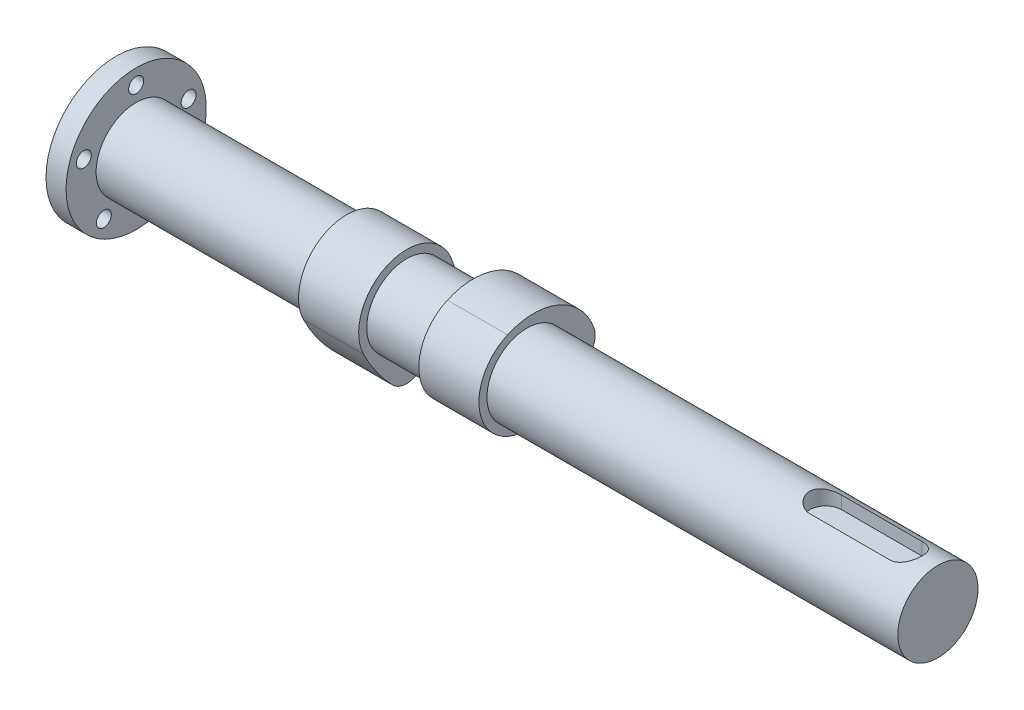
ISO-10303-21;
HEADER;
FILE_DESCRIPTION(('STEP AP214'),'2;1');
FILE_NAME('part.step','',(''),(''),'','','');
FILE_SCHEMA(('AUTOMOTIVE_DESIGN { 1 0 10303 214 1 1 1 1 }'));
ENDSEC;
DATA;
#1=APPLICATION_CONTEXT('core data for automotive mechanical design processes');
#2=APPLICATION_PROTOCOL_DEFINITION('international standard','automotive_design',2000,#1);
#3=PRODUCT_CONTEXT('',#1,'mechanical');
#4=PRODUCT('Part','Part','',(#3));
#5=PRODUCT_RELATED_PRODUCT_CATEGORY('part','',(#4));
#6=PRODUCT_DEFINITION_FORMATION('','',#4);
#7=PRODUCT_DEFINITION_CONTEXT('part definition',#1,'design');
#8=PRODUCT_DEFINITION('design','',#6,#7);
#9=PRODUCT_DEFINITION_SHAPE('','',#8);
#10=(LENGTH_UNIT() NAMED_UNIT(*) SI_UNIT(.MILLI.,.METRE.));
#11=(NAMED_UNIT(*) PLANE_ANGLE_UNIT() SI_UNIT($,.RADIAN.));
#12=(NAMED_UNIT(*) SI_UNIT($,.STERADIAN.) SOLID_ANGLE_UNIT());
#13=UNCERTAINTY_MEASURE_WITH_UNIT(LENGTH_MEASURE(1.E-05),#10,'distance_accuracy_value','');
#14=(GEOMETRIC_REPRESENTATION_CONTEXT(3) GLOBAL_UNCERTAINTY_ASSIGNED_CONTEXT((#13)) GLOBAL_UNIT_ASSIGNED_CONTEXT((#10,
#11,#12)) REPRESENTATION_CONTEXT('',''));
#15=CARTESIAN_POINT('',(0.,0.,0.));
#16=DIRECTION('',(0.,0.,1.));
#17=DIRECTION('',(1.,0.,0.));
#18=AXIS2_PLACEMENT_3D('',#15,#16,#17);
#19=CARTESIAN_POINT('',(-90.,-6.48945275792091,14.6248761670898));
#20=DIRECTION('',(1.,0.,0.));
#21=DIRECTION('',(0.,1.,0.));
#22=AXIS2_PLACEMENT_3D('',#19,#20,#21);
#23=CYLINDRICAL_SURFACE('',#22,64.);
#24=CARTESIAN_POINT('',(-30.,-6.48945275792091,14.6248761670898));
#25=DIRECTION('',(1.,0.,0.));
#26=DIRECTION('',(0.,1.,0.));
#27=AXIS2_PLACEMENT_3D('',#24,#25,#26);
#28=CIRCLE('',#27,64.);
#29=CARTESIAN_POINT('',(-30.,-66.8506881467066,-6.64767098504059));
#30=VERTEX_POINT('',#29);
#31=CARTESIAN_POINT('',(-30.,19.4683582737627,-43.8746285012695));
#32=VERTEX_POINT('',#31);
#33=EDGE_CURVE('E112',#30,#32,#28,.T.);
#34=ORIENTED_EDGE('',*,*,#33,.F.);
#35=DIRECTION('',(1.,0.,0.));
#36=VECTOR('',#35,1.);
#37=CARTESIAN_POINT('',(-90.,-66.8506881467066,-6.64767098504059));
#38=LINE('',#37,#36);
#39=CARTESIAN_POINT('',(-90.,-66.8506881467066,-6.64767098504059));
#40=VERTEX_POINT('',#39);
#41=EDGE_CURVE('E111',#40,#30,#38,.T.);
#42=ORIENTED_EDGE('',*,*,#41,.F.);
#43=CARTESIAN_POINT('',(-90.,-6.48945275792091,14.6248761670898));
#44=DIRECTION('',(1.,0.,0.));
#45=DIRECTION('',(0.,1.,0.));
#46=AXIS2_PLACEMENT_3D('',#43,#44,#45);
#47=CIRCLE('',#46,64.);
#48=CARTESIAN_POINT('',(-90.,19.4683582737627,-43.8746285012695));
#49=VERTEX_POINT('',#48);
#50=EDGE_CURVE('E106',#40,#49,#47,.T.);
#51=ORIENTED_EDGE('',*,*,#50,.T.);
#52=DIRECTION('',(1.,0.,0.));
#53=VECTOR('',#52,1.);
#54=CARTESIAN_POINT('',(-90.,19.4683582737627,-43.8746285012695));
#55=LINE('',#54,#53);
#56=EDGE_CURVE('E12',#49,#32,#55,.T.);
#57=ORIENTED_EDGE('',*,*,#56,.T.);
#58=EDGE_LOOP('',(#34,#42,#51,#57));
#59=FACE_BOUND('',#58,.T.);
#60=ADVANCED_FACE('F49',(#59),#23,.T.);
#61=CARTESIAN_POINT('',(-90.,0.,0.));
#62=DIRECTION('',(1.,0.,0.));
#63=DIRECTION('',(0.,1.,0.));
#64=AXIS2_PLACEMENT_3D('',#61,#62,#63);
#65=CYLINDRICAL_SURFACE('',#64,48.);
#66=CARTESIAN_POINT('',(-30.,0.,0.));
#67=DIRECTION('',(1.,0.,0.));
#68=DIRECTION('',(0.,-1.,0.));
#69=AXIS2_PLACEMENT_3D('',#66,#67,#68);
#70=CIRCLE('',#69,48.);
#71=CARTESIAN_POINT('',(-30.,-21.2249064673154,43.0523326366146));
#72=VERTEX_POINT('',#71);
#73=EDGE_CURVE('E114',#32,#72,#70,.T.);
#74=ORIENTED_EDGE('',*,*,#73,.F.);
#75=ORIENTED_EDGE('',*,*,#56,.F.);
#76=CARTESIAN_POINT('',(-90.,0.,0.));
#77=DIRECTION('',(1.,0.,0.));
#78=DIRECTION('',(0.,-1.,0.));
#79=AXIS2_PLACEMENT_3D('',#76,#77,#78);
#80=CIRCLE('',#79,48.);
#81=CARTESIAN_POINT('',(-90.,-21.2249064673154,43.0523326366146));
#82=VERTEX_POINT('',#81);
#83=EDGE_CURVE('E90',#49,#82,#80,.T.);
#84=ORIENTED_EDGE('',*,*,#83,.T.);
#85=DIRECTION('',(1.,0.,0.));
#86=VECTOR('',#85,1.);
#87=CARTESIAN_POINT('',(-90.,-21.2249064673154,43.0523326366146));
#88=LINE('',#87,#86);
#89=EDGE_CURVE('E57',#82,#72,#88,.T.);
#90=ORIENTED_EDGE('',*,*,#89,.T.);
#91=EDGE_LOOP('',(#74,#75,#84,#90));
#92=FACE_BOUND('',#91,.T.);
#93=ADVANCED_FACE('F104',(#92),#65,.T.);
#94=CARTESIAN_POINT('',(-90.,49.5247817570693,-100.455442818767));
#95=DIRECTION('',(1.,0.,0.));
#96=DIRECTION('',(0.,1.,0.));
#97=AXIS2_PLACEMENT_3D('',#94,#95,#96);
#98=CYLINDRICAL_SURFACE('',#97,160.);
#99=CARTESIAN_POINT('',(-30.,49.5247817570693,-100.455442818767));
#100=DIRECTION('',(1.,0.,0.));
#101=DIRECTION('',(0.,1.,0.));
#102=AXIS2_PLACEMENT_3D('',#99,#100,#101);
#103=CIRCLE('',#102,160.);
#104=CARTESIAN_POINT('',(-30.,-61.918171208394,14.3507775455384));
#105=VERTEX_POINT('',#104);
#106=EDGE_CURVE('E100',#72,#105,#103,.T.);
#107=ORIENTED_EDGE('',*,*,#106,.F.);
#108=ORIENTED_EDGE('',*,*,#89,.F.);
#109=CARTESIAN_POINT('',(-90.,49.5247817570693,-100.455442818767));
#110=DIRECTION('',(1.,0.,0.));
#111=DIRECTION('',(0.,1.,0.));
#112=AXIS2_PLACEMENT_3D('',#109,#110,#111);
#113=CIRCLE('',#112,160.);
#114=CARTESIAN_POINT('',(-90.,-61.918171208394,14.3507775455384));
#115=VERTEX_POINT('',#114);
#116=EDGE_CURVE('E93',#82,#115,#113,.T.);
#117=ORIENTED_EDGE('',*,*,#116,.T.);
#118=DIRECTION('',(1.,0.,0.));
#119=VECTOR('',#118,1.);
#120=CARTESIAN_POINT('',(-90.,-61.918171208394,14.3507775455384));
#121=LINE('',#120,#119);
#122=EDGE_CURVE('E103',#115,#105,#121,.T.);
#123=ORIENTED_EDGE('',*,*,#122,.T.);
#124=EDGE_LOOP('',(#107,#108,#117,#123));
#125=FACE_BOUND('',#124,.T.);
#126=ADVANCED_FACE('F99',(#125),#98,.T.);
#127=CARTESIAN_POINT('',(-90.,-47.987802087711,1.67548515481341E-13));
#128=DIRECTION('',(1.,0.,0.));
#129=DIRECTION('',(0.,1.,0.));
#130=AXIS2_PLACEMENT_3D('',#127,#128,#129);
#131=CYLINDRICAL_SURFACE('',#130,20.);
#132=CARTESIAN_POINT('',(-30.,-47.987802087711,1.67548515481341E-13));
#133=DIRECTION('',(1.,0.,0.));
#134=DIRECTION('',(0.,-1.,0.));
#135=AXIS2_PLACEMENT_3D('',#132,#133,#134);
#136=CIRCLE('',#135,20.);
#137=EDGE_CURVE('E79',#105,#30,#136,.T.);
#138=ORIENTED_EDGE('',*,*,#137,.F.);
#139=ORIENTED_EDGE('',*,*,#122,.F.);
#140=CARTESIAN_POINT('',(-90.,-47.987802087711,1.67548515481341E-13));
#141=DIRECTION('',(1.,0.,0.));
#142=DIRECTION('',(0.,-1.,0.));
#143=AXIS2_PLACEMENT_3D('',#140,#141,#142);
#144=CIRCLE('',#143,20.);
#145=EDGE_CURVE('E65',#115,#40,#144,.T.);
#146=ORIENTED_EDGE('',*,*,#145,.T.);
#147=ORIENTED_EDGE('',*,*,#41,.T.);
#148=EDGE_LOOP('',(#138,#139,#146,#147));
#149=FACE_BOUND('',#148,.T.);
#150=ADVANCED_FACE('F123',(#149),#131,.T.);
#151=CARTESIAN_POINT('',(-90.,-27.238627422816,7.31243808354501));
#152=DIRECTION('',(1.,0.,0.));
#153=DIRECTION('',(0.,1.,0.));
#154=AXIS2_PLACEMENT_3D('',#151,#152,#153);
#155=PLANE('',#154);
#156=ORIENTED_EDGE('',*,*,#50,.F.);
#157=ORIENTED_EDGE('',*,*,#145,.F.);
#158=ORIENTED_EDGE('',*,*,#116,.F.);
#159=ORIENTED_EDGE('',*,*,#83,.F.);
#160=EDGE_LOOP('',(#156,#157,#158,#159));
#161=FACE_BOUND('',#160,.T.);
#162=ADVANCED_FACE('F95',(#161),#155,.F.);
#163=CARTESIAN_POINT('',(-30.,-27.238627422816,7.31243808354501));
#164=DIRECTION('',(1.,0.,0.));
#165=DIRECTION('',(0.,1.,0.));
#166=AXIS2_PLACEMENT_3D('',#163,#164,#165);
#167=PLANE('',#166);
#168=ORIENTED_EDGE('',*,*,#33,.T.);
#169=ORIENTED_EDGE('',*,*,#73,.T.);
#170=ORIENTED_EDGE('',*,*,#106,.T.);
#171=ORIENTED_EDGE('',*,*,#137,.T.);
#172=EDGE_LOOP('',(#168,#169,#170,#171));
#173=FACE_BOUND('',#172,.T.);
#174=ADVANCED_FACE('F119',(#173),#167,.T.);
#175=CLOSED_SHELL('',(#60,#93,#126,#150,#162,#174));
#176=MANIFOLD_SOLID_BREP('B2',#175);
#177=CARTESIAN_POINT('',(90.,-14.6248761670898,-6.48945275792097));
#178=DIRECTION('',(-1.,0.,0.));
#179=DIRECTION('',(0.,0.,1.));
#180=AXIS2_PLACEMENT_3D('',#177,#178,#179);
#181=CYLINDRICAL_SURFACE('',#180,64.);
#182=CARTESIAN_POINT('',(30.,-14.6248761670898,-6.48945275792097));
#183=DIRECTION('',(1.,0.,0.));
#184=DIRECTION('',(0.,0.,1.));
#185=AXIS2_PLACEMENT_3D('',#182,#183,#184);
#186=CIRCLE('',#185,64.);
#187=CARTESIAN_POINT('',(30.,6.64767098504082,-66.8506881467065));
#188=VERTEX_POINT('',#187);
#189=CARTESIAN_POINT('',(30.,43.8746285012695,19.4683582737629));
#190=VERTEX_POINT('',#189);
#191=EDGE_CURVE('E269',#188,#190,#186,.T.);
#192=ORIENTED_EDGE('',*,*,#191,.T.);
#193=DIRECTION('',(-1.,0.,0.));
#194=VECTOR('',#193,1.);
#195=CARTESIAN_POINT('',(90.,43.8746285012695,19.4683582737629));
#196=LINE('',#195,#194);
#197=CARTESIAN_POINT('',(90.,43.8746285012695,19.4683582737629));
#198=VERTEX_POINT('',#197);
#199=EDGE_CURVE('E47',#198,#190,#196,.T.);
#200=ORIENTED_EDGE('',*,*,#199,.F.);
#201=CARTESIAN_POINT('',(90.,-14.6248761670898,-6.48945275792097));
#202=DIRECTION('',(1.,0.,0.));
#203=DIRECTION('',(0.,0.,1.));
#204=AXIS2_PLACEMENT_3D('',#201,#202,#203);
#205=CIRCLE('',#204,64.);
#206=CARTESIAN_POINT('',(90.,6.64767098504082,-66.8506881467065));
#207=VERTEX_POINT('',#206);
#208=EDGE_CURVE('E257',#207,#198,#205,.T.);
#209=ORIENTED_EDGE('',*,*,#208,.F.);
#210=DIRECTION('',(-1.,0.,0.));
#211=VECTOR('',#210,1.);
#212=CARTESIAN_POINT('',(90.,6.64767098504082,-66.8506881467065));
#213=LINE('',#212,#211);
#214=EDGE_CURVE('E265',#207,#188,#213,.T.);
#215=ORIENTED_EDGE('',*,*,#214,.T.);
#216=EDGE_LOOP('',(#192,#200,#209,#215));
#217=FACE_BOUND('',#216,.T.);
#218=ADVANCED_FACE('F206',(#217),#181,.T.);
#219=CARTESIAN_POINT('',(90.,0.,0.));
#220=DIRECTION('',(-1.,0.,0.));
#221=DIRECTION('',(0.,0.,1.));
#222=AXIS2_PLACEMENT_3D('',#219,#220,#221);
#223=CYLINDRICAL_SURFACE('',#222,48.);
#224=CARTESIAN_POINT('',(30.,0.,0.));
#225=DIRECTION('',(1.,0.,0.));
#226=DIRECTION('',(0.,0.,-1.));
#227=AXIS2_PLACEMENT_3D('',#224,#225,#226);
#228=CIRCLE('',#227,48.);
#229=CARTESIAN_POINT('',(30.,-43.0523326366145,-21.2249064673156));
#230=VERTEX_POINT('',#229);
#231=EDGE_CURVE('E261',#190,#230,#228,.T.);
#232=ORIENTED_EDGE('',*,*,#231,.T.);
#233=DIRECTION('',(-1.,0.,0.));
#234=VECTOR('',#233,1.);
#235=CARTESIAN_POINT('',(90.,-43.0523326366145,-21.2249064673156));
#236=LINE('',#235,#234);
#237=CARTESIAN_POINT('',(90.,-43.0523326366145,-21.2249064673156));
#238=VERTEX_POINT('',#237);
#239=EDGE_CURVE('E214',#238,#230,#236,.T.);
#240=ORIENTED_EDGE('',*,*,#239,.F.);
#241=CARTESIAN_POINT('',(90.,0.,0.));
#242=DIRECTION('',(1.,0.,0.));
#243=DIRECTION('',(0.,0.,-1.));
#244=AXIS2_PLACEMENT_3D('',#241,#242,#243);
#245=CIRCLE('',#244,48.);
#246=EDGE_CURVE('E252',#198,#238,#245,.T.);
#247=ORIENTED_EDGE('',*,*,#246,.F.);
#248=ORIENTED_EDGE('',*,*,#199,.T.);
#249=EDGE_LOOP('',(#232,#240,#247,#248));
#250=FACE_BOUND('',#249,.T.);
#251=ADVANCED_FACE('F260',(#250),#223,.T.);
#252=CARTESIAN_POINT('',(90.,100.455442818767,49.5247817570697));
#253=DIRECTION('',(-1.,0.,0.));
#254=DIRECTION('',(0.,0.,1.));
#255=AXIS2_PLACEMENT_3D('',#252,#253,#254);
#256=CYLINDRICAL_SURFACE('',#255,160.);
#257=CARTESIAN_POINT('',(30.,100.455442818767,49.5247817570697));
#258=DIRECTION('',(1.,0.,0.));
#259=DIRECTION('',(0.,0.,1.));
#260=AXIS2_PLACEMENT_3D('',#257,#258,#259);
#261=CIRCLE('',#260,160.);
#262=CARTESIAN_POINT('',(30.,-14.3507775455381,-61.918171208394));
#263=VERTEX_POINT('',#262);
#264=EDGE_CURVE('E239',#230,#263,#261,.T.);
#265=ORIENTED_EDGE('',*,*,#264,.T.);
#266=DIRECTION('',(-1.,0.,0.));
#267=VECTOR('',#266,1.);
#268=CARTESIAN_POINT('',(90.,-14.3507775455381,-61.918171208394));
#269=LINE('',#268,#267);
#270=CARTESIAN_POINT('',(90.,-14.3507775455381,-61.918171208394));
#271=VERTEX_POINT('',#270);
#272=EDGE_CURVE('E262',#271,#263,#269,.T.);
#273=ORIENTED_EDGE('',*,*,#272,.F.);
#274=CARTESIAN_POINT('',(90.,100.455442818767,49.5247817570697));
#275=DIRECTION('',(1.,0.,0.));
#276=DIRECTION('',(0.,0.,1.));
#277=AXIS2_PLACEMENT_3D('',#274,#275,#276);
#278=CIRCLE('',#277,160.);
#279=EDGE_CURVE('E255',#238,#271,#278,.T.);
#280=ORIENTED_EDGE('',*,*,#279,.F.);
#281=ORIENTED_EDGE('',*,*,#239,.T.);
#282=EDGE_LOOP('',(#265,#273,#280,#281));
#283=FACE_BOUND('',#282,.T.);
#284=ADVANCED_FACE('F263',(#283),#256,.T.);
#285=CARTESIAN_POINT('',(90.,0.,-47.987802087711));
#286=DIRECTION('',(-1.,0.,0.));
#287=DIRECTION('',(0.,0.,1.));
#288=AXIS2_PLACEMENT_3D('',#285,#286,#287);
#289=CYLINDRICAL_SURFACE('',#288,20.);
#290=CARTESIAN_POINT('',(30.,0.,-47.987802087711));
#291=DIRECTION('',(1.,0.,0.));
#292=DIRECTION('',(0.,0.,-1.));
#293=AXIS2_PLACEMENT_3D('',#290,#291,#292);
#294=CIRCLE('',#293,20.);
#295=EDGE_CURVE('E245',#263,#188,#294,.T.);
#296=ORIENTED_EDGE('',*,*,#295,.T.);
#297=ORIENTED_EDGE('',*,*,#214,.F.);
#298=CARTESIAN_POINT('',(90.,0.,-47.987802087711));
#299=DIRECTION('',(1.,0.,0.));
#300=DIRECTION('',(0.,0.,-1.));
#301=AXIS2_PLACEMENT_3D('',#298,#299,#300);
#302=CIRCLE('',#301,20.);
#303=EDGE_CURVE('E222',#271,#207,#302,.T.);
#304=ORIENTED_EDGE('',*,*,#303,.F.);
#305=ORIENTED_EDGE('',*,*,#272,.T.);
#306=EDGE_LOOP('',(#296,#297,#304,#305));
#307=FACE_BOUND('',#306,.T.);
#308=ADVANCED_FACE('F276',(#307),#289,.T.);
#309=CARTESIAN_POINT('',(90.,-7.31243808354491,-27.238627422816));
#310=DIRECTION('',(-1.,0.,0.));
#311=DIRECTION('',(0.,0.,1.));
#312=AXIS2_PLACEMENT_3D('',#309,#310,#311);
#313=PLANE('',#312);
#314=ORIENTED_EDGE('',*,*,#208,.T.);
#315=ORIENTED_EDGE('',*,*,#246,.T.);
#316=ORIENTED_EDGE('',*,*,#279,.T.);
#317=ORIENTED_EDGE('',*,*,#303,.T.);
#318=EDGE_LOOP('',(#314,#315,#316,#317));
#319=FACE_BOUND('',#318,.T.);
#320=ADVANCED_FACE('F253',(#319),#313,.F.);
#321=CARTESIAN_POINT('',(30.,-7.31243808354491,-27.238627422816));
#322=DIRECTION('',(-1.,0.,0.));
#323=DIRECTION('',(0.,0.,1.));
#324=AXIS2_PLACEMENT_3D('',#321,#322,#323);
#325=PLANE('',#324);
#326=ORIENTED_EDGE('',*,*,#191,.F.);
#327=ORIENTED_EDGE('',*,*,#295,.F.);
#328=ORIENTED_EDGE('',*,*,#264,.F.);
#329=ORIENTED_EDGE('',*,*,#231,.F.);
#330=EDGE_LOOP('',(#326,#327,#328,#329));
#331=FACE_BOUND('',#330,.T.);
#332=ADVANCED_FACE('F279',(#331),#325,.T.);
#333=CLOSED_SHELL('',(#218,#251,#284,#308,#320,#332));
#334=MANIFOLD_SOLID_BREP('B6',#333);
#335=CARTESIAN_POINT('',(500.,0.,0.));
#336=DIRECTION('',(-1.,0.,0.));
#337=DIRECTION('',(0.,0.,1.));
#338=AXIS2_PLACEMENT_3D('',#335,#336,#337);
#339=CYLINDRICAL_SURFACE('',#338,40.);
#340=DIRECTION('',(-1.,0.,0.));
#341=VECTOR('',#340,1.);
#342=CARTESIAN_POINT('',(500.,36.6606055596467,-16.));
#343=LINE('',#342,#341);
#344=CARTESIAN_POINT('',(388.,36.6606055596467,-16.));
#345=VERTEX_POINT('',#344);
#346=CARTESIAN_POINT('',(468.,36.6606055596467,-16.));
#347=VERTEX_POINT('',#346);
#348=EDGE_CURVE('E204',#345,#347,#343,.F.);
#349=ORIENTED_EDGE('',*,*,#348,.T.);
#350=CARTESIAN_POINT('',(468.,36.6606055596467,-16.));
#351=CARTESIAN_POINT('',(468.215232266255,36.6606022342479,-16.0000009073168));
#352=CARTESIAN_POINT('',(468.430435927484,36.6625017170069,-15.9956561916952));
#353=CARTESIAN_POINT('',(468.860418756028,36.6700715762966,-15.9782971795356));
#354=CARTESIAN_POINT('',(469.075197939252,36.6757418087194,-15.9652832143128));
#355=CARTESIAN_POINT('',(469.718113865339,36.698347673599,-15.9132903622523));
#356=CARTESIAN_POINT('',(470.145089569784,36.7208785559934,-15.8613604619386));
#357=CARTESIAN_POINT('',(470.990783171587,36.7799866576658,-15.7238071541753));
#358=CARTESIAN_POINT('',(471.409526923894,36.8165083374062,-15.6383169389576));
#359=CARTESIAN_POINT('',(472.2376279235,36.9024103841045,-15.4345172211247));
#360=CARTESIAN_POINT('',(472.646984596181,36.9517915359652,-15.3162057151697));
#361=CARTESIAN_POINT('',(473.45304820716,37.061792774546,-15.0480716123614));
#362=CARTESIAN_POINT('',(473.849771264314,37.1223978076208,-14.8982911863551));
#363=CARTESIAN_POINT('',(474.628911384329,37.25311913593,-14.5683421365685));
#364=CARTESIAN_POINT('',(475.011322924776,37.3232390553856,-14.3881619271124));
#365=CARTESIAN_POINT('',(475.759738741486,37.4710405566886,-13.9987318321452));
#366=CARTESIAN_POINT('',(476.1257351961,37.5487256885435,-13.7894682792886));
#367=CARTESIAN_POINT('',(476.839390995789,37.7095994765649,-13.3432516975933));
#368=CARTESIAN_POINT('',(477.187041759725,37.7927906678734,-13.1062858748405));
#369=CARTESIAN_POINT('',(477.879433399142,37.9668964503145,-12.5933248099132));
#370=CARTESIAN_POINT('',(478.223108658997,38.0579882882433,-12.3159504343752));
#371=CARTESIAN_POINT('',(478.88604917493,38.2413992876891,-11.7340694318295));
#372=CARTESIAN_POINT('',(479.205324033778,38.3337179494235,-11.4295735817007));
#373=CARTESIAN_POINT('',(479.817993932164,38.5172623313427,-10.7948910889782));
#374=CARTESIAN_POINT('',(480.111373336234,38.6084873628653,-10.4646891486259));
#375=CARTESIAN_POINT('',(480.670145856303,38.7874020208228,-9.78071295988958));
#376=CARTESIAN_POINT('',(480.935549350709,38.8750929508167,-9.42694753305162));
#377=CARTESIAN_POINT('',(481.446718051905,39.0480996403614,-8.68316773970124));
#378=CARTESIAN_POINT('',(481.691280731872,39.1331818443992,-8.29227094219725));
#379=CARTESIAN_POINT('',(482.146421340714,39.2947319151884,-7.48943819584196));
#380=CARTESIAN_POINT('',(482.356998110225,39.3711994880414,-7.07750152988633));
#381=CARTESIAN_POINT('',(482.742210760384,39.5132980821476,-6.235501254494));
#382=CARTESIAN_POINT('',(482.916858408925,39.5789326501467,-5.80544363600812));
#383=CARTESIAN_POINT('',(483.228551721722,39.6974557132789,-4.93020949083963));
#384=CARTESIAN_POINT('',(483.365599791049,39.7503450236409,-4.48503393322973));
#385=CARTESIAN_POINT('',(483.594919149244,39.8395645415726,-3.60488415181849));
#386=CARTESIAN_POINT('',(483.689036885804,39.8765724203721,-3.17045934173134));
#387=CARTESIAN_POINT('',(483.840885669694,39.9365594337076,-2.29433558999675));
#388=CARTESIAN_POINT('',(483.898617789389,39.9595389816892,-1.85263686312161));
#389=CARTESIAN_POINT('',(483.977041709229,39.9908060363953,-0.96557738517912));
#390=CARTESIAN_POINT('',(483.997744591918,39.9990979390033,-0.520217769887459));
#391=CARTESIAN_POINT('',(484.001906082129,40.0007623312592,0.370696064665621));
#392=CARTESIAN_POINT('',(483.985365998668,39.9941353452766,0.816250276537029));
#393=CARTESIAN_POINT('',(483.917212657819,39.9669459270936,1.67896485396341));
#394=CARTESIAN_POINT('',(483.86762475357,39.9471883928561,2.09631252182485));
#395=CARTESIAN_POINT('',(483.735952876982,39.8950693348063,2.92503002281218));
#396=CARTESIAN_POINT('',(483.653870355219,39.8627083736187,3.3364001219302));
#397=CARTESIAN_POINT('',(483.457991060954,39.7861957043969,4.15039353309384));
#398=CARTESIAN_POINT('',(483.344193679781,39.7420437700714,4.55301667710823));
#399=CARTESIAN_POINT('',(483.085905010252,39.6430361019424,5.34693755084675));
#400=CARTESIAN_POINT('',(482.941412856454,39.588180066339,5.738234960887));
#401=CARTESIAN_POINT('',(482.620540940853,39.4681865815894,6.51292526791052));
#402=CARTESIAN_POINT('',(482.443714629209,39.4029070198976,6.89611102274185));
#403=CARTESIAN_POINT('',(482.061058015368,39.2642529868001,7.64616997031892));
#404=CARTESIAN_POINT('',(481.855227620875,39.1908784896352,8.01304311115049));
#405=CARTESIAN_POINT('',(481.41599219437,39.0377571264425,8.72853894651205));
#406=CARTESIAN_POINT('',(481.182584174428,38.9580095702216,9.07715965754486));
#407=CARTESIAN_POINT('',(480.689611242733,38.7939710843159,9.7544495231471));
#408=CARTESIAN_POINT('',(480.430036219728,38.7096784042361,10.0831108859629));
#409=CARTESIAN_POINT('',(479.86856202585,38.5329367412558,10.7394457708262));
#410=CARTESIAN_POINT('',(479.565006715402,38.4403143220413,11.0656573763036));
#411=CARTESIAN_POINT('',(478.931697134883,38.2545465496133,11.6917219967377));
#412=CARTESIAN_POINT('',(478.601930576272,38.1614009703735,11.9915625077886));
#413=CARTESIAN_POINT('',(477.918038201276,37.9770854778806,12.5630884040816));
#414=CARTESIAN_POINT('',(477.563900964125,37.885916517607,12.8347604372496));
#415=CARTESIAN_POINT('',(476.833561495373,37.7081746860326,13.3479318439862));
#416=CARTESIAN_POINT('',(476.457369635678,37.621599690191,13.5894452360064));
#417=CARTESIAN_POINT('',(475.673557205613,37.4530743442594,14.0473666299774));
#418=CARTESIAN_POINT('',(475.26533830715,37.3713342590365,14.2628299303688));
#419=CARTESIAN_POINT('',(474.430403535794,37.2180305632751,14.6582118111789));
#420=CARTESIAN_POINT('',(474.003695770245,37.14646255006,14.8381457826101));
#421=CARTESIAN_POINT('',(473.1350899003,37.0160114223421,15.1606450968847));
#422=CARTESIAN_POINT('',(472.693211426313,36.9571125821942,15.3032568143013));
#423=CARTESIAN_POINT('',(471.797330419179,36.8540606972271,15.5497932647103));
#424=CARTESIAN_POINT('',(471.343333419985,36.8099010420511,15.6537353430005));
#425=CARTESIAN_POINT('',(470.41019627094,36.7367022435718,15.8247837381258));
#426=CARTESIAN_POINT('',(469.930738066417,36.7082615304563,15.8904368612125));
#427=CARTESIAN_POINT('',(469.208363427163,36.6797234784683,15.9561390024195));
#428=CARTESIAN_POINT('',(468.967096499808,36.6725646546207,15.972576777522));
#429=CARTESIAN_POINT('',(468.483900349367,36.6630023768199,15.9945095479741));
#430=CARTESIAN_POINT('',(468.241970951321,36.6606003316177,16.0000013015914));
#431=CARTESIAN_POINT('',(468.,36.6606055596467,16.));
#432=B_SPLINE_CURVE_WITH_KNOTS('',3,(#350,#351,#352,#353,#354,#355,#356,#357,#358,#359,#360,
#361,#362,#363,#364,#365,#366,#367,#368,#369,#370,#371,#372,#373,#374,#375,#376,#377,#378,#379,
#380,#381,#382,#383,#384,#385,#386,#387,#388,#389,#390,#391,#392,#393,#394,#395,#396,#397,#398,
#399,#400,#401,#402,#403,#404,#405,#406,#407,#408,#409,#410,#411,#412,#413,#414,#415,#416,#417,
#418,#419,#420,#421,#422,#423,#424,#425,#426,#427,#428,#429,#430,#431),.UNSPECIFIED.,.F.,.F.,(4,
2,2,2,2,2,2,2,2,2,2,2,2,2,2,2,2,2,2,2,2,2,2,2,2,2,2,2,2,2,2,2,2,2,2,2,2,2,2,2,4),(0.,
0.645587827480941,1.29115098375713,2.58149827010943,3.86677544905797,5.15213109578212,
6.43577512684925,7.71990947774204,9.00464934460684,10.2899849126092,11.6413057997882,
12.9920921068334,14.343688507056,15.6947817188681,17.0996654494602,18.504597094865,
19.909067846662,21.3134487399986,22.6498444568765,23.9862007853488,25.3221570864685,
26.6580664320893,27.9188253339778,29.1795279612698,30.4402547856029,31.7010171609898,
32.9807251331774,34.2604371776861,35.5402880014736,36.8206352850399,38.1844716285515,
39.5489511901607,40.9140745968454,42.2785610809435,43.6830887577321,45.087006663424,
46.4891717657128,47.890707165233,49.3424573224882,50.0679988269936,50.793755173214),.UNSPECIFIED.);
#433=CARTESIAN_POINT('',(468.,36.6606055596467,16.));
#434=VERTEX_POINT('',#433);
#435=EDGE_CURVE('E408',#347,#434,#432,.T.);
#436=ORIENTED_EDGE('',*,*,#435,.T.);
#437=DIRECTION('',(-1.,0.,0.));
#438=VECTOR('',#437,1.);
#439=CARTESIAN_POINT('',(500.,36.6606055596467,16.));
#440=LINE('',#439,#438);
#441=CARTESIAN_POINT('',(388.,36.6606055596467,16.));
#442=VERTEX_POINT('',#441);
#443=EDGE_CURVE('E337',#434,#442,#440,.T.);
#444=ORIENTED_EDGE('',*,*,#443,.T.);
#445=CARTESIAN_POINT('',(388.,36.6606055596467,16.));
#446=CARTESIAN_POINT('',(387.784767733745,36.6606022342478,16.0000009073168));
#447=CARTESIAN_POINT('',(387.569564072516,36.6625017170069,15.9956561916952));
#448=CARTESIAN_POINT('',(387.139581243972,36.6700715762966,15.9782971795356));
#449=CARTESIAN_POINT('',(386.924802060747,36.6757418087194,15.9652832143128));
#450=CARTESIAN_POINT('',(386.28188613466,36.698347673599,15.9132903622523));
#451=CARTESIAN_POINT('',(385.854910430216,36.7208785559934,15.8613604619386));
#452=CARTESIAN_POINT('',(385.009216828413,36.7799866576658,15.7238071541754));
#453=CARTESIAN_POINT('',(384.590473076106,36.8165083374062,15.6383169389577));
#454=CARTESIAN_POINT('',(383.7623720765,36.9024103841045,15.4345172211248));
#455=CARTESIAN_POINT('',(383.353015403819,36.9517915359652,15.3162057151697));
#456=CARTESIAN_POINT('',(382.54695179284,37.061792774546,15.0480716123614));
#457=CARTESIAN_POINT('',(382.150228735686,37.1223978076208,14.8982911863551));
#458=CARTESIAN_POINT('',(381.37108861567,37.25311913593,14.5683421365685));
#459=CARTESIAN_POINT('',(380.988677075224,37.3232390553856,14.3881619271125));
#460=CARTESIAN_POINT('',(380.240261258514,37.4710405566886,13.9987318321452));
#461=CARTESIAN_POINT('',(379.8742648039,37.5487256885435,13.7894682792887));
#462=CARTESIAN_POINT('',(379.160609004211,37.7095994765649,13.3432516975933));
#463=CARTESIAN_POINT('',(378.812958240274,37.7927906678734,13.1062858748405));
#464=CARTESIAN_POINT('',(378.120566600858,37.9668964503145,12.5933248099133));
#465=CARTESIAN_POINT('',(377.776891341003,38.0579882882433,12.3159504343752));
#466=CARTESIAN_POINT('',(377.11395082507,38.2413992876891,11.7340694318295));
#467=CARTESIAN_POINT('',(376.794675966222,38.3337179494235,11.4295735817007));
#468=CARTESIAN_POINT('',(376.182006067836,38.5172623313427,10.7948910889782));
#469=CARTESIAN_POINT('',(375.888626663766,38.6084873628653,10.4646891486259));
#470=CARTESIAN_POINT('',(375.329854143696,38.7874020208228,9.78071295988961));
#471=CARTESIAN_POINT('',(375.064450649291,38.8750929508167,9.42694753305165));
#472=CARTESIAN_POINT('',(374.553281948094,39.0480996403614,8.68316773970126));
#473=CARTESIAN_POINT('',(374.308719268128,39.1331818443992,8.29227094219726));
#474=CARTESIAN_POINT('',(373.853578659286,39.2947319151884,7.48943819584197));
#475=CARTESIAN_POINT('',(373.643001889774,39.3711994880414,7.07750152988635));
#476=CARTESIAN_POINT('',(373.257789239616,39.5132980821475,6.23550125449404));
#477=CARTESIAN_POINT('',(373.083141591075,39.5789326501467,5.80544363600816));
#478=CARTESIAN_POINT('',(372.771448278278,39.6974557132789,4.93020949083965));
#479=CARTESIAN_POINT('',(372.634400208951,39.7503450236409,4.48503393322974));
#480=CARTESIAN_POINT('',(372.405080850755,39.8395645415726,3.60488415181848));
#481=CARTESIAN_POINT('',(372.310963114196,39.8765724203721,3.17045934173133));
#482=CARTESIAN_POINT('',(372.159114330306,39.9365594337076,2.29433558999675));
#483=CARTESIAN_POINT('',(372.101382210611,39.9595389816892,1.85263686312161));
#484=CARTESIAN_POINT('',(372.022958290771,39.9908060363953,0.965577385179131));
#485=CARTESIAN_POINT('',(372.002255408082,39.9990979390033,0.520217769887474));
#486=CARTESIAN_POINT('',(371.998093917871,40.0007623312592,-0.3706960646656));
#487=CARTESIAN_POINT('',(372.014634001332,39.9941353452766,-0.816250276537004));
#488=CARTESIAN_POINT('',(372.082787342181,39.9669459270936,-1.67896485396339));
#489=CARTESIAN_POINT('',(372.13237524643,39.9471883928561,-2.09631252182483));
#490=CARTESIAN_POINT('',(372.264047123018,39.8950693348063,-2.92503002281218));
#491=CARTESIAN_POINT('',(372.346129644781,39.8627083736187,-3.3364001219302));
#492=CARTESIAN_POINT('',(372.542008939046,39.7861957043969,-4.15039353309384));
#493=CARTESIAN_POINT('',(372.655806320219,39.7420437700714,-4.55301667710824));
#494=CARTESIAN_POINT('',(372.914094989748,39.6430361019424,-5.34693755084675));
#495=CARTESIAN_POINT('',(373.058587143546,39.588180066339,-5.73823496088699));
#496=CARTESIAN_POINT('',(373.379459059147,39.4681865815894,-6.51292526791051));
#497=CARTESIAN_POINT('',(373.556285370791,39.4029070198976,-6.89611102274184));
#498=CARTESIAN_POINT('',(373.938941984632,39.2642529868001,-7.64616997031891));
#499=CARTESIAN_POINT('',(374.144772379125,39.1908784896352,-8.01304311115049));
#500=CARTESIAN_POINT('',(374.584007805629,39.0377571264425,-8.72853894651204));
#501=CARTESIAN_POINT('',(374.817415825572,38.9580095702216,-9.07715965754484));
#502=CARTESIAN_POINT('',(375.310388757267,38.7939710843159,-9.75444952314707));
#503=CARTESIAN_POINT('',(375.569963780272,38.7096784042361,-10.0831108859629));
#504=CARTESIAN_POINT('',(376.13143797415,38.5329367412558,-10.7394457708262));
#505=CARTESIAN_POINT('',(376.434993284598,38.4403143220413,-11.0656573763036));
#506=CARTESIAN_POINT('',(377.068302865117,38.2545465496133,-11.6917219967377));
#507=CARTESIAN_POINT('',(377.398069423728,38.1614009703734,-11.9915625077886));
#508=CARTESIAN_POINT('',(378.081961798724,37.9770854778806,-12.5630884040817));
#509=CARTESIAN_POINT('',(378.436099035875,37.885916517607,-12.8347604372496));
#510=CARTESIAN_POINT('',(379.166438504627,37.7081746860326,-13.3479318439862));
#511=CARTESIAN_POINT('',(379.542630364322,37.621599690191,-13.5894452360064));
#512=CARTESIAN_POINT('',(380.326442794387,37.4530743442594,-14.0473666299774));
#513=CARTESIAN_POINT('',(380.73466169285,37.3713342590365,-14.2628299303688));
#514=CARTESIAN_POINT('',(381.569596464206,37.2180305632751,-14.6582118111789));
#515=CARTESIAN_POINT('',(381.996304229755,37.14646255006,-14.8381457826101));
#516=CARTESIAN_POINT('',(382.8649100997,37.0160114223421,-15.1606450968847));
#517=CARTESIAN_POINT('',(383.306788573687,36.9571125821942,-15.3032568143013));
#518=CARTESIAN_POINT('',(384.202669580821,36.8540606972271,-15.5497932647103));
#519=CARTESIAN_POINT('',(384.656666580015,36.8099010420511,-15.6537353430005));
#520=CARTESIAN_POINT('',(385.58980372906,36.7367022435718,-15.8247837381258));
#521=CARTESIAN_POINT('',(386.069261933583,36.7082615304563,-15.8904368612125));
#522=CARTESIAN_POINT('',(386.791636572837,36.6797234784683,-15.9561390024195));
#523=CARTESIAN_POINT('',(387.032903500192,36.6725646546207,-15.972576777522));
#524=CARTESIAN_POINT('',(387.516099650633,36.6630023768199,-15.9945095479741));
#525=CARTESIAN_POINT('',(387.758029048679,36.6606003316177,-16.0000013015914));
#526=CARTESIAN_POINT('',(388.,36.6606055596467,-16.));
#527=B_SPLINE_CURVE_WITH_KNOTS('',3,(#445,#446,#447,#448,#449,#450,#451,#452,#453,#454,#455,
#456,#457,#458,#459,#460,#461,#462,#463,#464,#465,#466,#467,#468,#469,#470,#471,#472,#473,#474,
#475,#476,#477,#478,#479,#480,#481,#482,#483,#484,#485,#486,#487,#488,#489,#490,#491,#492,#493,
#494,#495,#496,#497,#498,#499,#500,#501,#502,#503,#504,#505,#506,#507,#508,#509,#510,#511,#512,
#513,#514,#515,#516,#517,#518,#519,#520,#521,#522,#523,#524,#525,#526),.UNSPECIFIED.,.F.,.F.,(4,
2,2,2,2,2,2,2,2,2,2,2,2,2,2,2,2,2,2,2,2,2,2,2,2,2,2,2,2,2,2,2,2,2,2,2,2,2,2,2,4),(0.,
0.645587827480941,1.29115098375713,2.58149827010938,3.86677544905797,5.15213109578212,
6.43577512684925,7.71990947774204,9.00464934460678,10.2899849126092,11.6413057997882,
12.9920921068334,14.343688507056,15.6947817188681,17.0996654494602,18.504597094865,
19.909067846662,21.3134487399986,22.6498444568765,23.9862007853489,25.3221570864685,
26.6580664320893,27.9188253339778,29.1795279612698,30.440254785603,31.7010171609899,
32.9807251331774,34.2604371776861,35.5402880014736,36.8206352850399,38.1844716285515,
39.5489511901608,40.9140745968455,42.2785610809435,43.6830887577321,45.087006663424,
46.4891717657128,47.890707165233,49.3424573224882,50.0679988269935,50.7937551732139),.UNSPECIFIED.);
#528=EDGE_CURVE('E344',#442,#345,#527,.T.);
#529=ORIENTED_EDGE('',*,*,#528,.T.);
#530=EDGE_LOOP('',(#349,#436,#444,#529));
#531=FACE_BOUND('',#530,.T.);
#532=CARTESIAN_POINT('',(500.,0.,0.));
#533=DIRECTION('',(1.,0.,0.));
#534=DIRECTION('',(0.,0.,-1.));
#535=AXIS2_PLACEMENT_3D('',#532,#533,#534);
#536=CIRCLE('',#535,40.);
#537=CARTESIAN_POINT('',(500.,0.,-40.));
#538=VERTEX_POINT('',#537);
#539=EDGE_CURVE('E402',#538,#538,#536,.T.);
#540=ORIENTED_EDGE('',*,*,#539,.F.);
#541=EDGE_LOOP('',(#540));
#542=FACE_BOUND('',#541,.T.);
#543=CARTESIAN_POINT('',(-300.,0.,0.));
#544=DIRECTION('',(1.,0.,0.));
#545=DIRECTION('',(0.,0.,-1.));
#546=AXIS2_PLACEMENT_3D('',#543,#544,#545);
#547=CIRCLE('',#546,40.);
#548=CARTESIAN_POINT('',(-300.,0.,-40.));
#549=VERTEX_POINT('',#548);
#550=EDGE_CURVE('E389',#549,#549,#547,.T.);
#551=ORIENTED_EDGE('',*,*,#550,.T.);
#552=EDGE_LOOP('',(#551));
#553=FACE_BOUND('',#552,.T.);
#554=ADVANCED_FACE('F329',(#531,#542,#553),#339,.T.);
#555=CARTESIAN_POINT('',(500.,0.,0.));
#556=DIRECTION('',(1.,0.,0.));
#557=DIRECTION('',(0.,0.,-1.));
#558=AXIS2_PLACEMENT_3D('',#555,#556,#557);
#559=PLANE('',#558);
#560=ORIENTED_EDGE('',*,*,#539,.T.);
#561=EDGE_LOOP('',(#560));
#562=FACE_BOUND('',#561,.T.);
#563=ADVANCED_FACE('F432',(#562),#559,.T.);
#564=CARTESIAN_POINT('',(388.,24.,0.));
#565=DIRECTION('',(0.,1.,0.));
#566=DIRECTION('',(0.,0.,1.));
#567=AXIS2_PLACEMENT_3D('',#564,#565,#566);
#568=CYLINDRICAL_SURFACE('',#567,16.);
#569=DIRECTION('',(0.,1.,0.));
#570=VECTOR('',#569,1.);
#571=CARTESIAN_POINT('',(388.,24.,16.));
#572=LINE('',#571,#570);
#573=CARTESIAN_POINT('',(388.,24.,16.));
#574=VERTEX_POINT('',#573);
#575=EDGE_CURVE('E367',#574,#442,#572,.T.);
#576=ORIENTED_EDGE('',*,*,#575,.F.);
#577=CARTESIAN_POINT('',(388.,24.,0.));
#578=DIRECTION('',(0.,1.,0.));
#579=DIRECTION('',(0.,0.,1.));
#580=AXIS2_PLACEMENT_3D('',#577,#578,#579);
#581=CIRCLE('',#580,16.);
#582=CARTESIAN_POINT('',(388.,24.,-16.));
#583=VERTEX_POINT('',#582);
#584=EDGE_CURVE('E371',#583,#574,#581,.T.);
#585=ORIENTED_EDGE('',*,*,#584,.F.);
#586=DIRECTION('',(0.,1.,0.));
#587=VECTOR('',#586,1.);
#588=CARTESIAN_POINT('',(388.,24.,-16.));
#589=LINE('',#588,#587);
#590=EDGE_CURVE('E400',#583,#345,#589,.T.);
#591=ORIENTED_EDGE('',*,*,#590,.T.);
#592=ORIENTED_EDGE('',*,*,#528,.F.);
#593=EDGE_LOOP('',(#576,#585,#591,#592));
#594=FACE_BOUND('',#593,.T.);
#595=ADVANCED_FACE('F369',(#594),#568,.F.);
#596=CARTESIAN_POINT('',(388.,24.,-16.));
#597=DIRECTION('',(0.,0.,-1.));
#598=DIRECTION('',(-1.,0.,0.));
#599=AXIS2_PLACEMENT_3D('',#596,#597,#598);
#600=PLANE('',#599);
#601=ORIENTED_EDGE('',*,*,#590,.F.);
#602=DIRECTION('',(-1.,0.,0.));
#603=VECTOR('',#602,1.);
#604=CARTESIAN_POINT('',(388.,24.,-16.));
#605=LINE('',#604,#603);
#606=CARTESIAN_POINT('',(468.,24.,-16.));
#607=VERTEX_POINT('',#606);
#608=EDGE_CURVE('E376',#607,#583,#605,.T.);
#609=ORIENTED_EDGE('',*,*,#608,.F.);
#610=DIRECTION('',(0.,1.,0.));
#611=VECTOR('',#610,1.);
#612=CARTESIAN_POINT('',(468.,24.,-16.));
#613=LINE('',#612,#611);
#614=EDGE_CURVE('E403',#607,#347,#613,.T.);
#615=ORIENTED_EDGE('',*,*,#614,.T.);
#616=ORIENTED_EDGE('',*,*,#348,.F.);
#617=EDGE_LOOP('',(#601,#609,#615,#616));
#618=FACE_BOUND('',#617,.T.);
#619=ADVANCED_FACE('F426',(#618),#600,.F.);
#620=CARTESIAN_POINT('',(468.,24.,0.));
#621=DIRECTION('',(0.,1.,0.));
#622=DIRECTION('',(0.,0.,1.));
#623=AXIS2_PLACEMENT_3D('',#620,#621,#622);
#624=CYLINDRICAL_SURFACE('',#623,16.);
#625=ORIENTED_EDGE('',*,*,#614,.F.);
#626=CARTESIAN_POINT('',(468.,24.,0.));
#627=DIRECTION('',(0.,1.,0.));
#628=DIRECTION('',(0.,0.,1.));
#629=AXIS2_PLACEMENT_3D('',#626,#627,#628);
#630=CIRCLE('',#629,16.);
#631=CARTESIAN_POINT('',(468.,24.,16.));
#632=VERTEX_POINT('',#631);
#633=EDGE_CURVE('E385',#632,#607,#630,.T.);
#634=ORIENTED_EDGE('',*,*,#633,.F.);
#635=DIRECTION('',(0.,1.,0.));
#636=VECTOR('',#635,1.);
#637=CARTESIAN_POINT('',(468.,24.,16.));
#638=LINE('',#637,#636);
#639=EDGE_CURVE('E375',#632,#434,#638,.T.);
#640=ORIENTED_EDGE('',*,*,#639,.T.);
#641=ORIENTED_EDGE('',*,*,#435,.F.);
#642=EDGE_LOOP('',(#625,#634,#640,#641));
#643=FACE_BOUND('',#642,.T.);
#644=ADVANCED_FACE('F421',(#643),#624,.F.);
#645=CARTESIAN_POINT('',(388.,24.,16.));
#646=DIRECTION('',(0.,0.,1.));
#647=DIRECTION('',(1.,0.,0.));
#648=AXIS2_PLACEMENT_3D('',#645,#646,#647);
#649=PLANE('',#648);
#650=ORIENTED_EDGE('',*,*,#639,.F.);
#651=DIRECTION('',(1.,0.,0.));
#652=VECTOR('',#651,1.);
#653=CARTESIAN_POINT('',(388.,24.,16.));
#654=LINE('',#653,#652);
#655=EDGE_CURVE('E379',#574,#632,#654,.T.);
#656=ORIENTED_EDGE('',*,*,#655,.F.);
#657=ORIENTED_EDGE('',*,*,#575,.T.);
#658=ORIENTED_EDGE('',*,*,#443,.F.);
#659=EDGE_LOOP('',(#650,#656,#657,#658));
#660=FACE_BOUND('',#659,.T.);
#661=ADVANCED_FACE('F380',(#660),#649,.F.);
#662=CARTESIAN_POINT('',(388.,24.,0.));
#663=DIRECTION('',(0.,1.,0.));
#664=DIRECTION('',(0.,0.,1.));
#665=AXIS2_PLACEMENT_3D('',#662,#663,#664);
#666=PLANE('',#665);
#667=ORIENTED_EDGE('',*,*,#584,.T.);
#668=ORIENTED_EDGE('',*,*,#655,.T.);
#669=ORIENTED_EDGE('',*,*,#633,.T.);
#670=ORIENTED_EDGE('',*,*,#608,.T.);
#671=EDGE_LOOP('',(#667,#668,#669,#670));
#672=FACE_BOUND('',#671,.T.);
#673=ADVANCED_FACE('F387',(#672),#666,.T.);
#674=CARTESIAN_POINT('',(-320.,0.,0.));
#675=DIRECTION('',(1.,0.,0.));
#676=DIRECTION('',(0.,0.,-1.));
#677=AXIS2_PLACEMENT_3D('',#674,#675,#676);
#678=CYLINDRICAL_SURFACE('',#677,70.);
#679=CARTESIAN_POINT('',(-320.,0.,0.));
#680=DIRECTION('',(-1.,0.,0.));
#681=DIRECTION('',(0.,0.,1.));
#682=AXIS2_PLACEMENT_3D('',#679,#680,#681);
#683=CIRCLE('',#682,70.);
#684=CARTESIAN_POINT('',(-320.,0.,70.));
#685=VERTEX_POINT('',#684);
#686=EDGE_CURVE('E392',#685,#685,#683,.T.);
#687=ORIENTED_EDGE('',*,*,#686,.F.);
#688=EDGE_LOOP('',(#687));
#689=FACE_BOUND('',#688,.T.);
#690=CARTESIAN_POINT('',(-300.,0.,0.));
#691=DIRECTION('',(-1.,0.,0.));
#692=DIRECTION('',(0.,0.,1.));
#693=AXIS2_PLACEMENT_3D('',#690,#691,#692);
#694=CIRCLE('',#693,70.);
#695=CARTESIAN_POINT('',(-300.,0.,70.));
#696=VERTEX_POINT('',#695);
#697=EDGE_CURVE('E395',#696,#696,#694,.T.);
#698=ORIENTED_EDGE('',*,*,#697,.T.);
#699=EDGE_LOOP('',(#698));
#700=FACE_BOUND('',#699,.T.);
#701=ADVANCED_FACE('F499',(#689,#700),#678,.T.);
#702=CARTESIAN_POINT('',(-320.,0.,0.));
#703=DIRECTION('',(-1.,0.,0.));
#704=DIRECTION('',(0.,0.,1.));
#705=AXIS2_PLACEMENT_3D('',#702,#703,#704);
#706=PLANE('',#705);
#707=CARTESIAN_POINT('',(-320.,16.995934690622,-52.3081083962335));
#708=DIRECTION('',(-1.,0.,0.));
#709=DIRECTION('',(0.,0.951056516295155,0.309016994374945));
#710=AXIS2_PLACEMENT_3D('',#707,#708,#709);
#711=CIRCLE('',#710,7.5);
#712=CARTESIAN_POINT('',(-320.,24.1288585628356,-49.9904809384214));
#713=VERTEX_POINT('',#712);
#714=EDGE_CURVE('E462',#713,#713,#711,.T.);
#715=ORIENTED_EDGE('',*,*,#714,.F.);
#716=EDGE_LOOP('',(#715));
#717=FACE_BOUND('',#716,.T.);
#718=CARTESIAN_POINT('',(-320.,-44.4959346906223,-32.3281888760858));
#719=DIRECTION('',(-1.,0.,0.));
#720=DIRECTION('',(0.,0.587785252292469,-0.809016994374951));
#721=AXIS2_PLACEMENT_3D('',#718,#719,#720);
#722=CIRCLE('',#721,7.5);
#723=CARTESIAN_POINT('',(-320.,-40.0875452984288,-38.3958163338979));
#724=VERTEX_POINT('',#723);
#725=EDGE_CURVE('E478',#724,#724,#722,.T.);
#726=ORIENTED_EDGE('',*,*,#725,.F.);
#727=EDGE_LOOP('',(#726));
#728=FACE_BOUND('',#727,.T.);
#729=CARTESIAN_POINT('',(-320.,-44.4959346906218,32.3281888760864));
#730=DIRECTION('',(-1.,0.,0.));
#731=DIRECTION('',(0.,-0.58778525229248,-0.809016994374942));
#732=AXIS2_PLACEMENT_3D('',#729,#730,#731);
#733=CIRCLE('',#732,7.5);
#734=CARTESIAN_POINT('',(-320.,-48.9043240828154,26.2605614182743));
#735=VERTEX_POINT('',#734);
#736=EDGE_CURVE('E472',#735,#735,#733,.T.);
#737=ORIENTED_EDGE('',*,*,#736,.F.);
#738=EDGE_LOOP('',(#737));
#739=FACE_BOUND('',#738,.T.);
#740=CARTESIAN_POINT('',(-320.,16.9959346906227,52.3081083962333));
#741=DIRECTION('',(-1.,0.,0.));
#742=DIRECTION('',(0.,-0.95105651629515,0.309016994374958));
#743=AXIS2_PLACEMENT_3D('',#740,#741,#742);
#744=CIRCLE('',#743,7.5);
#745=CARTESIAN_POINT('',(-320.,9.86301081840908,54.6257358540454));
#746=VERTEX_POINT('',#745);
#747=EDGE_CURVE('E465',#746,#746,#744,.T.);
#748=ORIENTED_EDGE('',*,*,#747,.F.);
#749=EDGE_LOOP('',(#748));
#750=FACE_BOUND('',#749,.T.);
#751=CARTESIAN_POINT('',(-320.,55.,0.));
#752=DIRECTION('',(-1.,0.,0.));
#753=DIRECTION('',(0.,0.,1.));
#754=AXIS2_PLACEMENT_3D('',#751,#752,#753);
#755=CIRCLE('',#754,7.5);
#756=CARTESIAN_POINT('',(-320.,55.,7.5));
#757=VERTEX_POINT('',#756);
#758=EDGE_CURVE('E457',#757,#757,#755,.T.);
#759=ORIENTED_EDGE('',*,*,#758,.F.);
#760=EDGE_LOOP('',(#759));
#761=FACE_BOUND('',#760,.T.);
#762=ORIENTED_EDGE('',*,*,#686,.T.);
#763=EDGE_LOOP('',(#762));
#764=FACE_BOUND('',#763,.T.);
#765=ADVANCED_FACE('F448',(#717,#728,#739,#750,#761,#764),#706,.T.);
#766=CARTESIAN_POINT('',(-300.,0.,0.));
#767=DIRECTION('',(-1.,0.,0.));
#768=DIRECTION('',(0.,0.,1.));
#769=AXIS2_PLACEMENT_3D('',#766,#767,#768);
#770=PLANE('',#769);
#771=CARTESIAN_POINT('',(-300.,16.995934690622,-52.3081083962335));
#772=DIRECTION('',(-1.,0.,0.));
#773=DIRECTION('',(0.,0.951056516295155,0.309016994374945));
#774=AXIS2_PLACEMENT_3D('',#771,#772,#773);
#775=CIRCLE('',#774,7.5);
#776=CARTESIAN_POINT('',(-300.,24.1288585628356,-49.9904809384214));
#777=VERTEX_POINT('',#776);
#778=EDGE_CURVE('E481',#777,#777,#775,.T.);
#779=ORIENTED_EDGE('',*,*,#778,.T.);
#780=EDGE_LOOP('',(#779));
#781=FACE_BOUND('',#780,.T.);
#782=CARTESIAN_POINT('',(-300.,-44.4959346906223,-32.3281888760858));
#783=DIRECTION('',(-1.,0.,0.));
#784=DIRECTION('',(0.,0.587785252292469,-0.809016994374951));
#785=AXIS2_PLACEMENT_3D('',#782,#783,#784);
#786=CIRCLE('',#785,7.5);
#787=CARTESIAN_POINT('',(-300.,-40.0875452984288,-38.3958163338979));
#788=VERTEX_POINT('',#787);
#789=EDGE_CURVE('E475',#788,#788,#786,.T.);
#790=ORIENTED_EDGE('',*,*,#789,.T.);
#791=EDGE_LOOP('',(#790));
#792=FACE_BOUND('',#791,.T.);
#793=CARTESIAN_POINT('',(-300.,-44.4959346906218,32.3281888760864));
#794=DIRECTION('',(-1.,0.,0.));
#795=DIRECTION('',(0.,-0.58778525229248,-0.809016994374942));
#796=AXIS2_PLACEMENT_3D('',#793,#794,#795);
#797=CIRCLE('',#796,7.5);
#798=CARTESIAN_POINT('',(-300.,-48.9043240828154,26.2605614182743));
#799=VERTEX_POINT('',#798);
#800=EDGE_CURVE('E468',#799,#799,#797,.T.);
#801=ORIENTED_EDGE('',*,*,#800,.T.);
#802=EDGE_LOOP('',(#801));
#803=FACE_BOUND('',#802,.T.);
#804=CARTESIAN_POINT('',(-300.,16.9959346906227,52.3081083962333));
#805=DIRECTION('',(-1.,0.,0.));
#806=DIRECTION('',(0.,-0.95105651629515,0.309016994374958));
#807=AXIS2_PLACEMENT_3D('',#804,#805,#806);
#808=CIRCLE('',#807,7.5);
#809=CARTESIAN_POINT('',(-300.,9.86301081840908,54.6257358540454));
#810=VERTEX_POINT('',#809);
#811=EDGE_CURVE('E469',#810,#810,#808,.T.);
#812=ORIENTED_EDGE('',*,*,#811,.T.);
#813=EDGE_LOOP('',(#812));
#814=FACE_BOUND('',#813,.T.);
#815=CARTESIAN_POINT('',(-300.,55.,0.));
#816=DIRECTION('',(-1.,0.,0.));
#817=DIRECTION('',(0.,0.,1.));
#818=AXIS2_PLACEMENT_3D('',#815,#816,#817);
#819=CIRCLE('',#818,7.5);
#820=CARTESIAN_POINT('',(-300.,55.,7.5));
#821=VERTEX_POINT('',#820);
#822=EDGE_CURVE('E454',#821,#821,#819,.T.);
#823=ORIENTED_EDGE('',*,*,#822,.T.);
#824=EDGE_LOOP('',(#823));
#825=FACE_BOUND('',#824,.T.);
#826=ORIENTED_EDGE('',*,*,#550,.F.);
#827=EDGE_LOOP('',(#826));
#828=FACE_BOUND('',#827,.T.);
#829=ORIENTED_EDGE('',*,*,#697,.F.);
#830=EDGE_LOOP('',(#829));
#831=FACE_BOUND('',#830,.T.);
#832=ADVANCED_FACE('F444',(#781,#792,#803,#814,#825,#828,#831),#770,.F.);
#833=CARTESIAN_POINT('',(-300.,55.,0.));
#834=DIRECTION('',(-1.,0.,0.));
#835=DIRECTION('',(0.,0.,1.));
#836=AXIS2_PLACEMENT_3D('',#833,#834,#835);
#837=CYLINDRICAL_SURFACE('',#836,7.5);
#838=ORIENTED_EDGE('',*,*,#822,.F.);
#839=EDGE_LOOP('',(#838));
#840=FACE_BOUND('',#839,.T.);
#841=ORIENTED_EDGE('',*,*,#758,.T.);
#842=EDGE_LOOP('',(#841));
#843=FACE_BOUND('',#842,.T.);
#844=ADVANCED_FACE('F447',(#840,#843),#837,.F.);
#845=CARTESIAN_POINT('',(-300.,16.9959346906227,52.3081083962333));
#846=DIRECTION('',(-1.,0.,0.));
#847=DIRECTION('',(0.,-0.95105651629515,0.309016994374958));
#848=AXIS2_PLACEMENT_3D('',#845,#846,#847);
#849=CYLINDRICAL_SURFACE('',#848,7.5);
#850=ORIENTED_EDGE('',*,*,#811,.F.);
#851=EDGE_LOOP('',(#850));
#852=FACE_BOUND('',#851,.T.);
#853=ORIENTED_EDGE('',*,*,#747,.T.);
#854=EDGE_LOOP('',(#853));
#855=FACE_BOUND('',#854,.T.);
#856=ADVANCED_FACE('F519',(#852,#855),#849,.F.);
#857=CARTESIAN_POINT('',(-300.,-44.4959346906218,32.3281888760864));
#858=DIRECTION('',(-1.,0.,0.));
#859=DIRECTION('',(0.,-0.58778525229248,-0.809016994374942));
#860=AXIS2_PLACEMENT_3D('',#857,#858,#859);
#861=CYLINDRICAL_SURFACE('',#860,7.5);
#862=ORIENTED_EDGE('',*,*,#800,.F.);
#863=EDGE_LOOP('',(#862));
#864=FACE_BOUND('',#863,.T.);
#865=ORIENTED_EDGE('',*,*,#736,.T.);
#866=EDGE_LOOP('',(#865));
#867=FACE_BOUND('',#866,.T.);
#868=ADVANCED_FACE('F523',(#864,#867),#861,.F.);
#869=CARTESIAN_POINT('',(-300.,-44.4959346906223,-32.3281888760858));
#870=DIRECTION('',(-1.,0.,0.));
#871=DIRECTION('',(0.,0.587785252292469,-0.809016994374951));
#872=AXIS2_PLACEMENT_3D('',#869,#870,#871);
#873=CYLINDRICAL_SURFACE('',#872,7.5);
#874=ORIENTED_EDGE('',*,*,#789,.F.);
#875=EDGE_LOOP('',(#874));
#876=FACE_BOUND('',#875,.T.);
#877=ORIENTED_EDGE('',*,*,#725,.T.);
#878=EDGE_LOOP('',(#877));
#879=FACE_BOUND('',#878,.T.);
#880=ADVANCED_FACE('F493',(#876,#879),#873,.F.);
#881=CARTESIAN_POINT('',(-300.,16.995934690622,-52.3081083962335));
#882=DIRECTION('',(-1.,0.,0.));
#883=DIRECTION('',(0.,0.951056516295155,0.309016994374945));
#884=AXIS2_PLACEMENT_3D('',#881,#882,#883);
#885=CYLINDRICAL_SURFACE('',#884,7.5);
#886=ORIENTED_EDGE('',*,*,#778,.F.);
#887=EDGE_LOOP('',(#886));
#888=FACE_BOUND('',#887,.T.);
#889=ORIENTED_EDGE('',*,*,#714,.T.);
#890=EDGE_LOOP('',(#889));
#891=FACE_BOUND('',#890,.T.);
#892=ADVANCED_FACE('F490',(#888,#891),#885,.F.);
#893=CLOSED_SHELL('',(#554,#563,#595,#619,#644,#661,#673,#701,#765,#832,#844,#856,#868,#880,#892));
#894=MANIFOLD_SOLID_BREP('B41',#893);
#895=ADVANCED_BREP_SHAPE_REPRESENTATION('',(#18,#176,#334,#894),#14);
#896=SHAPE_DEFINITION_REPRESENTATION(#9,#895);
ENDSEC;
END-ISO-10303-21;
